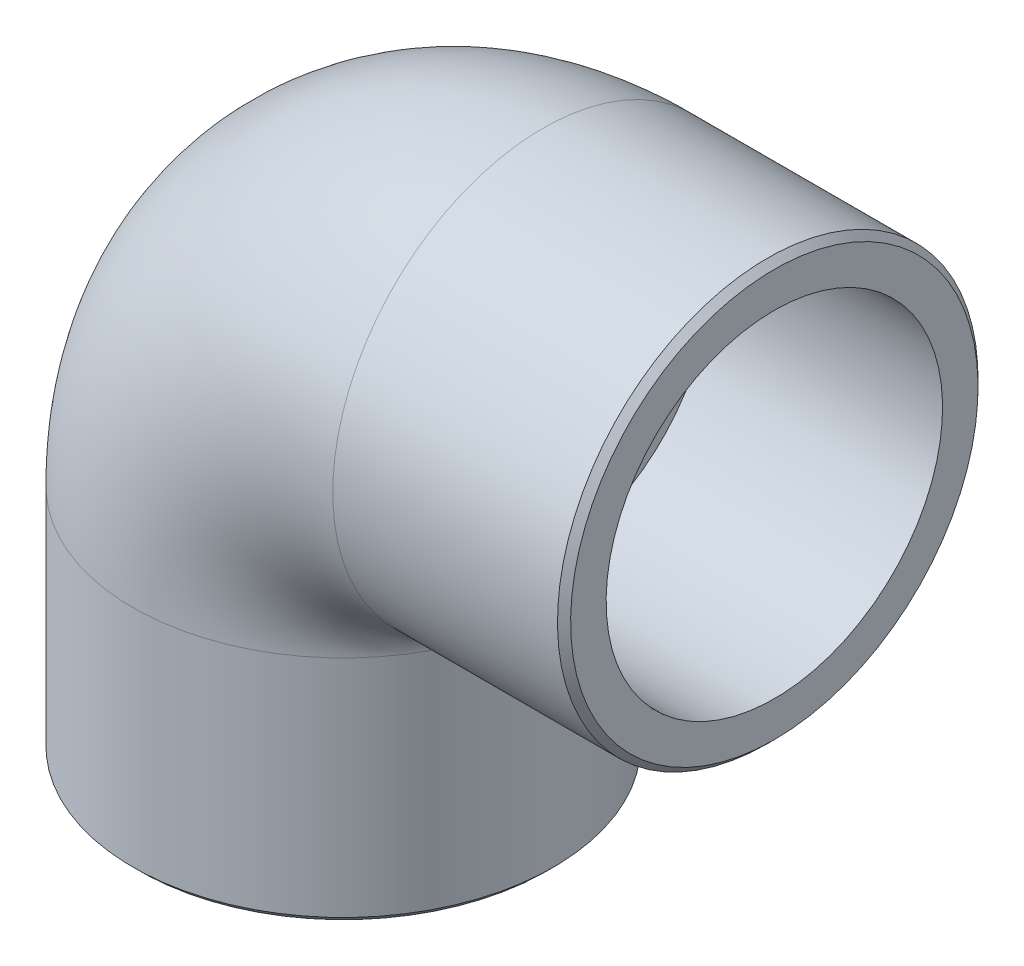
ISO-10303-21;
HEADER;
FILE_DESCRIPTION(('STEP AP214'),'2;1');
FILE_NAME('part.step','',(''),(''),'','','');
FILE_SCHEMA(('AUTOMOTIVE_DESIGN { 1 0 10303 214 1 1 1 1 }'));
ENDSEC;
DATA;
#1=APPLICATION_CONTEXT('core data for automotive mechanical design processes');
#2=APPLICATION_PROTOCOL_DEFINITION('international standard','automotive_design',2000,#1);
#3=PRODUCT_CONTEXT('',#1,'mechanical');
#4=PRODUCT('Part','Part','',(#3));
#5=PRODUCT_RELATED_PRODUCT_CATEGORY('part','',(#4));
#6=PRODUCT_DEFINITION_FORMATION('','',#4);
#7=PRODUCT_DEFINITION_CONTEXT('part definition',#1,'design');
#8=PRODUCT_DEFINITION('design','',#6,#7);
#9=PRODUCT_DEFINITION_SHAPE('','',#8);
#10=(LENGTH_UNIT() NAMED_UNIT(*) SI_UNIT(.MILLI.,.METRE.));
#11=(NAMED_UNIT(*) PLANE_ANGLE_UNIT() SI_UNIT($,.RADIAN.));
#12=(NAMED_UNIT(*) SI_UNIT($,.STERADIAN.) SOLID_ANGLE_UNIT());
#13=UNCERTAINTY_MEASURE_WITH_UNIT(LENGTH_MEASURE(1.E-05),#10,'distance_accuracy_value','');
#14=(GEOMETRIC_REPRESENTATION_CONTEXT(3) GLOBAL_UNCERTAINTY_ASSIGNED_CONTEXT((#13)) GLOBAL_UNIT_ASSIGNED_CONTEXT((#10,
#11,#12)) REPRESENTATION_CONTEXT('',''));
#15=CARTESIAN_POINT('',(0.,0.,0.));
#16=DIRECTION('',(0.,0.,1.));
#17=DIRECTION('',(1.,0.,0.));
#18=AXIS2_PLACEMENT_3D('',#15,#16,#17);
#19=CARTESIAN_POINT('',(-0.481657463317404,-42.8223375673182,1.1966189299482E-09));
#20=DIRECTION('',(0.,-1.,0.));
#21=DIRECTION('',(0.,0.,1.));
#22=AXIS2_PLACEMENT_3D('',#19,#20,#21);
#23=CYLINDRICAL_SURFACE('',#22,21.1239);
#24=CARTESIAN_POINT('',(-0.481657463317404,-42.1622156923182,1.1966189299482E-09));
#25=DIRECTION('',(0.,-1.,0.));
#26=DIRECTION('',(0.,0.,-1.));
#27=AXIS2_PLACEMENT_3D('',#24,#25,#26);
#28=CIRCLE('',#27,21.1239);
#29=CARTESIAN_POINT('',(-0.481657463317404,-42.1622156923182,-21.1238999988034));
#30=VERTEX_POINT('',#29);
#31=EDGE_CURVE('E11',#30,#30,#28,.T.);
#32=ORIENTED_EDGE('',*,*,#31,.F.);
#33=EDGE_LOOP('',(#32));
#34=FACE_BOUND('',#33,.T.);
#35=CARTESIAN_POINT('',(-0.481657463317404,0.48165743268279,1.1966189299482E-09));
#36=DIRECTION('',(0.707106781186547,0.707106781186547,0.));
#37=DIRECTION('',(0.707106781186548,-0.707106781186547,0.));
#38=AXIS2_PLACEMENT_3D('',#35,#36,#37);
#39=ELLIPSE('',#38,29.873705870212,21.1238999999993);
#40=CARTESIAN_POINT('',(19.5860475366845,-19.5860475673187,-6.59593565971424));
#41=VERTEX_POINT('',#40);
#42=CARTESIAN_POINT('',(19.5860475366845,-19.5860475673188,6.59593566210731));
#43=VERTEX_POINT('',#42);
#44=EDGE_CURVE('E59',#41,#43,#39,.F.);
#45=ORIENTED_EDGE('',*,*,#44,.T.);
#46=CARTESIAN_POINT('',(-0.481657463317404,-19.5860475673182,1.1966189299482E-09));
#47=DIRECTION('',(0.,1.,0.));
#48=DIRECTION('',(0.,0.,1.));
#49=AXIS2_PLACEMENT_3D('',#46,#47,#48);
#50=CIRCLE('',#49,21.1239);
#51=EDGE_CURVE('E62',#41,#43,#50,.T.);
#52=ORIENTED_EDGE('',*,*,#51,.F.);
#53=EDGE_LOOP('',(#45,#52));
#54=FACE_BOUND('',#53,.T.);
#55=ADVANCED_FACE('F39',(#34,#54),#23,.T.);
#56=CARTESIAN_POINT('',(-21.6055574633174,-42.8223375673182,1.1966189299482E-09));
#57=DIRECTION('',(0.,1.,0.));
#58=DIRECTION('',(0.,0.,-1.));
#59=AXIS2_PLACEMENT_3D('',#56,#57,#58);
#60=PLANE('',#59);
#61=CARTESIAN_POINT('',(-0.481657463317404,-42.8223375673182,1.1966189299482E-09));
#62=DIRECTION('',(0.,-1.,0.));
#63=DIRECTION('',(0.,0.,-1.));
#64=AXIS2_PLACEMENT_3D('',#61,#62,#63);
#65=CIRCLE('',#64,20.463778125);
#66=CARTESIAN_POINT('',(-0.481657463317404,-42.8223375673182,-20.4637781238034));
#67=VERTEX_POINT('',#66);
#68=EDGE_CURVE('E47',#67,#67,#65,.F.);
#69=ORIENTED_EDGE('',*,*,#68,.F.);
#70=EDGE_LOOP('',(#69));
#71=FACE_BOUND('',#70,.T.);
#72=CARTESIAN_POINT('',(-0.481657463317404,-42.8223375673182,1.1966189299482E-09));
#73=DIRECTION('',(0.,1.,0.));
#74=DIRECTION('',(0.,0.,1.));
#75=AXIS2_PLACEMENT_3D('',#72,#73,#74);
#76=CIRCLE('',#75,16.89912);
#77=CARTESIAN_POINT('',(-0.481657463317404,-42.8223375673182,16.8991200011966));
#78=VERTEX_POINT('',#77);
#79=EDGE_CURVE('E88',#78,#78,#76,.T.);
#80=ORIENTED_EDGE('',*,*,#79,.T.);
#81=EDGE_LOOP('',(#80));
#82=FACE_BOUND('',#81,.T.);
#83=ADVANCED_FACE('F82',(#71,#82),#60,.F.);
#84=CARTESIAN_POINT('',(-0.481657463317406,0.48165743268279,1.1966189299482E-09));
#85=DIRECTION('',(-1.,0.,0.));
#86=DIRECTION('',(0.,-1.,0.));
#87=AXIS2_PLACEMENT_3D('',#84,#85,#86);
#88=CYLINDRICAL_SURFACE('',#87,21.1238999999985);
#89=CARTESIAN_POINT('',(42.1622156616839,0.481657432682793,1.1966189299482E-09));
#90=DIRECTION('',(1.,0.,0.));
#91=DIRECTION('',(0.,-1.,0.));
#92=AXIS2_PLACEMENT_3D('',#89,#90,#91);
#93=CIRCLE('',#92,21.1238999999985);
#94=CARTESIAN_POINT('',(42.1622156616839,-20.6422425673157,1.1966189299482E-09));
#95=VERTEX_POINT('',#94);
#96=EDGE_CURVE('E65',#95,#95,#93,.T.);
#97=ORIENTED_EDGE('',*,*,#96,.F.);
#98=EDGE_LOOP('',(#97));
#99=FACE_BOUND('',#98,.T.);
#100=CARTESIAN_POINT('',(19.5860475366845,0.481657432682792,1.1966189299482E-09));
#101=DIRECTION('',(1.,0.,0.));
#102=DIRECTION('',(0.,-1.,0.));
#103=AXIS2_PLACEMENT_3D('',#100,#101,#102);
#104=CIRCLE('',#103,21.123899999999);
#105=EDGE_CURVE('E53',#41,#43,#104,.T.);
#106=ORIENTED_EDGE('',*,*,#105,.T.);
#107=ORIENTED_EDGE('',*,*,#44,.F.);
#108=EDGE_LOOP('',(#106,#107));
#109=FACE_BOUND('',#108,.T.);
#110=ADVANCED_FACE('F57',(#99,#109),#88,.T.);
#111=CARTESIAN_POINT('',(42.8223375366845,21.6055574326807,1.1966189299482E-09));
#112=DIRECTION('',(-1.,0.,0.));
#113=DIRECTION('',(0.,-1.,0.));
#114=AXIS2_PLACEMENT_3D('',#111,#112,#113);
#115=PLANE('',#114);
#116=CARTESIAN_POINT('',(42.8223375366845,0.481657432682793,1.1966189299482E-09));
#117=DIRECTION('',(1.,0.,0.));
#118=DIRECTION('',(0.,-1.,0.));
#119=AXIS2_PLACEMENT_3D('',#116,#117,#118);
#120=CIRCLE('',#119,20.4637781249979);
#121=CARTESIAN_POINT('',(42.8223375366845,-19.9821206923151,1.1966189299482E-09));
#122=VERTEX_POINT('',#121);
#123=EDGE_CURVE('E76',#122,#122,#120,.F.);
#124=ORIENTED_EDGE('',*,*,#123,.F.);
#125=EDGE_LOOP('',(#124));
#126=FACE_BOUND('',#125,.T.);
#127=CARTESIAN_POINT('',(42.8223375366845,0.481657432679896,1.1966189299482E-09));
#128=DIRECTION('',(-1.,0.,0.));
#129=DIRECTION('',(0.,1.,0.));
#130=AXIS2_PLACEMENT_3D('',#127,#128,#129);
#131=CIRCLE('',#130,16.8991199999991);
#132=CARTESIAN_POINT('',(42.8223375366845,17.380777432679,1.1966189299482E-09));
#133=VERTEX_POINT('',#132);
#134=EDGE_CURVE('E209',#133,#133,#131,.T.);
#135=ORIENTED_EDGE('',*,*,#134,.T.);
#136=EDGE_LOOP('',(#135));
#137=FACE_BOUND('',#136,.T.);
#138=ADVANCED_FACE('F141',(#126,#137),#115,.F.);
#139=CARTESIAN_POINT('',(-0.481657463317405,-19.5860475673182,1.1966189299482E-09));
#140=DIRECTION('',(0.,1.,0.));
#141=DIRECTION('',(-1.,0.,0.));
#142=AXIS2_PLACEMENT_3D('',#139,#140,#141);
#143=CIRCLE('',#142,21.1238999999997);
#144=TRIMMED_CURVE('',#143,(PARAMETER_VALUE(-2.82403222429831)),
(PARAMETER_VALUE(2.82403222429831)),.T.,.PARAMETER.);
#145=CARTESIAN_POINT('',(19.5860475366826,-19.5860475673182,1.1966189299482E-09));
#146=DIRECTION('',(0.,0.,1.));
#147=AXIS1_PLACEMENT('',#145,#146);
#148=SURFACE_OF_REVOLUTION('',#144,#147);
#149=ORIENTED_EDGE('',*,*,#105,.F.);
#150=ORIENTED_EDGE('',*,*,#51,.T.);
#151=EDGE_LOOP('',(#149,#150));
#152=FACE_BOUND('',#151,.T.);
#153=ADVANCED_FACE('F63',(#152),#148,.T.);
#154=CARTESIAN_POINT('',(19.5860475366826,-19.5860475673182,1.1966189299482E-09));
#155=DIRECTION('',(0.,0.,1.));
#156=DIRECTION('',(-1.,0.,0.));
#157=AXIS2_PLACEMENT_3D('',#154,#155,#156);
#158=TOROIDAL_SURFACE('',#157,20.067705,14.7867299999997);
#159=CARTESIAN_POINT('',(19.5860475366826,0.481657432681845,1.1966189299482E-09));
#160=DIRECTION('',(-1.,0.,0.));
#161=DIRECTION('',(0.,1.,0.));
#162=AXIS2_PLACEMENT_3D('',#159,#160,#161);
#163=CIRCLE('',#162,14.7867299999997);
#164=CARTESIAN_POINT('',(19.5860475366826,15.2683874326816,1.1966189299482E-09));
#165=VERTEX_POINT('',#164);
#166=EDGE_CURVE('E91',#165,#165,#163,.F.);
#167=CARTESIAN_POINT('',(-0.481657463317404,-19.5860475673182,1.1966189299482E-09));
#168=DIRECTION('',(0.,1.,0.));
#169=DIRECTION('',(0.,0.,1.));
#170=AXIS2_PLACEMENT_3D('',#167,#168,#169);
#171=CIRCLE('',#170,14.7867299999997);
#172=CARTESIAN_POINT('',(-15.2683874633171,-19.5860475673182,1.1966189299482E-09));
#173=VERTEX_POINT('',#172);
#174=EDGE_CURVE('E60',#173,#173,#171,.F.);
#175=CARTESIAN_POINT('',(19.5860475366826,-19.5860475673182,1.1966189299482E-09));
#176=DIRECTION('',(0.,0.,1.));
#177=DIRECTION('',(-1.,0.,0.));
#178=AXIS2_PLACEMENT_3D('',#175,#176,#177);
#179=CIRCLE('',#178,34.8544349999997);
#180=EDGE_CURVE('',#165,#173,#179,.T.);
#181=ORIENTED_EDGE('',*,*,#166,.T.);
#182=ORIENTED_EDGE('',*,*,#174,.T.);
#183=ORIENTED_EDGE('',*,*,#180,.T.);
#184=ORIENTED_EDGE('',*,*,#180,.F.);
#185=EDGE_LOOP('',(#181,#183,#182,#184));
#186=FACE_BOUND('',#185,.T.);
#187=ADVANCED_FACE('F101',(#186),#158,.F.);
#188=CARTESIAN_POINT('',(-0.481657463317404,-19.5860475673182,1.1966189299482E-09));
#189=DIRECTION('',(0.,-1.,0.));
#190=DIRECTION('',(0.,0.,1.));
#191=AXIS2_PLACEMENT_3D('',#188,#189,#190);
#192=PLANE('',#191);
#193=CARTESIAN_POINT('',(-0.481657463317404,-19.5860475673182,1.1966189299482E-09));
#194=DIRECTION('',(0.,1.,0.));
#195=DIRECTION('',(0.,0.,1.));
#196=AXIS2_PLACEMENT_3D('',#193,#194,#195);
#197=CIRCLE('',#196,16.89912);
#198=CARTESIAN_POINT('',(-0.481657463317404,-19.5860475673182,16.8991200011966));
#199=VERTEX_POINT('',#198);
#200=EDGE_CURVE('E90',#199,#199,#197,.T.);
#201=ORIENTED_EDGE('',*,*,#200,.F.);
#202=EDGE_LOOP('',(#201));
#203=FACE_BOUND('',#202,.T.);
#204=ORIENTED_EDGE('',*,*,#174,.F.);
#205=EDGE_LOOP('',(#204));
#206=FACE_BOUND('',#205,.T.);
#207=ADVANCED_FACE('F104',(#203,#206),#192,.T.);
#208=CARTESIAN_POINT('',(-0.481657463317404,-19.5860475673182,1.1966189299482E-09));
#209=DIRECTION('',(0.,-1.,0.));
#210=DIRECTION('',(0.,0.,1.));
#211=AXIS2_PLACEMENT_3D('',#208,#209,#210);
#212=CYLINDRICAL_SURFACE('',#211,16.89912);
#213=ORIENTED_EDGE('',*,*,#200,.T.);
#214=EDGE_LOOP('',(#213));
#215=FACE_BOUND('',#214,.T.);
#216=ORIENTED_EDGE('',*,*,#79,.F.);
#217=EDGE_LOOP('',(#216));
#218=FACE_BOUND('',#217,.T.);
#219=ADVANCED_FACE('F106',(#215,#218),#212,.F.);
#220=CARTESIAN_POINT('',(19.5860475366843,0.481657432679896,1.1966189299482E-09));
#221=DIRECTION('',(1.,0.,0.));
#222=DIRECTION('',(0.,1.,0.));
#223=AXIS2_PLACEMENT_3D('',#220,#221,#222);
#224=PLANE('',#223);
#225=CARTESIAN_POINT('',(19.5860475366843,0.481657432679896,1.1966189299482E-09));
#226=DIRECTION('',(-1.,0.,0.));
#227=DIRECTION('',(0.,1.,0.));
#228=AXIS2_PLACEMENT_3D('',#225,#226,#227);
#229=CIRCLE('',#228,16.8991199999991);
#230=CARTESIAN_POINT('',(19.5860475366843,17.380777432679,1.1966189299482E-09));
#231=VERTEX_POINT('',#230);
#232=EDGE_CURVE('E96',#231,#231,#229,.T.);
#233=ORIENTED_EDGE('',*,*,#232,.F.);
#234=EDGE_LOOP('',(#233));
#235=FACE_BOUND('',#234,.T.);
#236=ORIENTED_EDGE('',*,*,#166,.F.);
#237=EDGE_LOOP('',(#236));
#238=FACE_BOUND('',#237,.T.);
#239=ADVANCED_FACE('F113',(#235,#238),#224,.T.);
#240=CARTESIAN_POINT('',(19.5860475366843,0.481657432679896,1.1966189299482E-09));
#241=DIRECTION('',(1.,0.,0.));
#242=DIRECTION('',(0.,1.,0.));
#243=AXIS2_PLACEMENT_3D('',#240,#241,#242);
#244=CYLINDRICAL_SURFACE('',#243,16.8991199999991);
#245=ORIENTED_EDGE('',*,*,#232,.T.);
#246=EDGE_LOOP('',(#245));
#247=FACE_BOUND('',#246,.T.);
#248=ORIENTED_EDGE('',*,*,#134,.F.);
#249=EDGE_LOOP('',(#248));
#250=FACE_BOUND('',#249,.T.);
#251=ADVANCED_FACE('F128',(#247,#250),#244,.F.);
#252=CARTESIAN_POINT('',(42.1622156616839,0.481657432682793,1.1966189299482E-09));
#253=DIRECTION('',(-1.,0.,0.));
#254=DIRECTION('',(0.,-1.,0.));
#255=AXIS2_PLACEMENT_3D('',#252,#253,#254);
#256=CONICAL_SURFACE('',#255,21.1238999999985,0.785398163397448);
#257=ORIENTED_EDGE('',*,*,#123,.T.);
#258=EDGE_LOOP('',(#257));
#259=FACE_BOUND('',#258,.T.);
#260=ORIENTED_EDGE('',*,*,#96,.T.);
#261=EDGE_LOOP('',(#260));
#262=FACE_BOUND('',#261,.T.);
#263=ADVANCED_FACE('F126',(#259,#262),#256,.T.);
#264=CARTESIAN_POINT('',(-0.481657463317404,-42.8223375673182,1.1966189299482E-09));
#265=DIRECTION('',(0.,1.,0.));
#266=DIRECTION('',(0.,0.,-1.));
#267=AXIS2_PLACEMENT_3D('',#264,#265,#266);
#268=CONICAL_SURFACE('',#267,20.463778125,0.785398163397451);
#269=ORIENTED_EDGE('',*,*,#31,.T.);
#270=EDGE_LOOP('',(#269));
#271=FACE_BOUND('',#270,.T.);
#272=ORIENTED_EDGE('',*,*,#68,.T.);
#273=EDGE_LOOP('',(#272));
#274=FACE_BOUND('',#273,.T.);
#275=ADVANCED_FACE('F41',(#271,#274),#268,.T.);
#276=CLOSED_SHELL('',(#55,#83,#110,#138,#153,#187,#207,#219,#239,#251,#263,#275));
#277=MANIFOLD_SOLID_BREP('B2',#276);
#278=ADVANCED_BREP_SHAPE_REPRESENTATION('',(#18,#277),#14);
#279=SHAPE_DEFINITION_REPRESENTATION(#9,#278);
ENDSEC;
END-ISO-10303-21;
